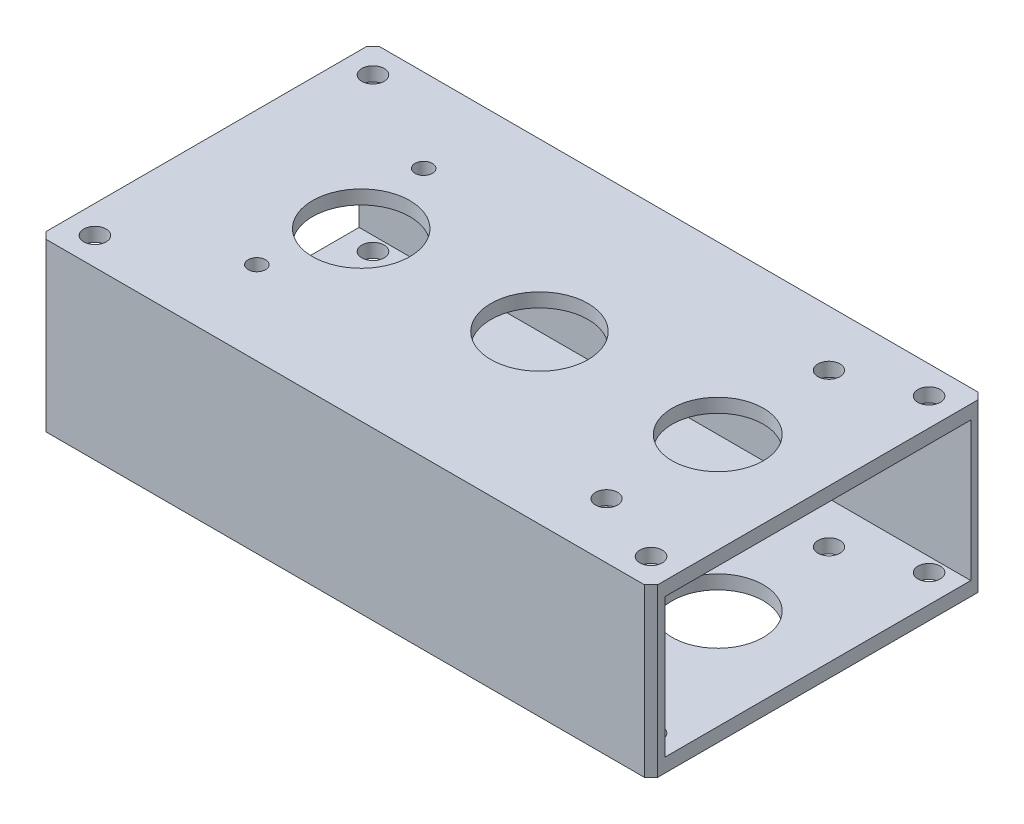
ISO-10303-21;
HEADER;
FILE_DESCRIPTION(('STEP AP214'),'2;1');
FILE_NAME('part.step','',(''),(''),'','','');
FILE_SCHEMA(('AUTOMOTIVE_DESIGN { 1 0 10303 214 1 1 1 1 }'));
ENDSEC;
DATA;
#1=APPLICATION_CONTEXT('core data for automotive mechanical design processes');
#2=APPLICATION_PROTOCOL_DEFINITION('international standard','automotive_design',2000,#1);
#3=PRODUCT_CONTEXT('',#1,'mechanical');
#4=PRODUCT('Part','Part','',(#3));
#5=PRODUCT_RELATED_PRODUCT_CATEGORY('part','',(#4));
#6=PRODUCT_DEFINITION_FORMATION('','',#4);
#7=PRODUCT_DEFINITION_CONTEXT('part definition',#1,'design');
#8=PRODUCT_DEFINITION('design','',#6,#7);
#9=PRODUCT_DEFINITION_SHAPE('','',#8);
#10=(LENGTH_UNIT() NAMED_UNIT(*) SI_UNIT(.MILLI.,.METRE.));
#11=(NAMED_UNIT(*) PLANE_ANGLE_UNIT() SI_UNIT($,.RADIAN.));
#12=(NAMED_UNIT(*) SI_UNIT($,.STERADIAN.) SOLID_ANGLE_UNIT());
#13=UNCERTAINTY_MEASURE_WITH_UNIT(LENGTH_MEASURE(1.E-05),#10,'distance_accuracy_value','');
#14=(GEOMETRIC_REPRESENTATION_CONTEXT(3) GLOBAL_UNCERTAINTY_ASSIGNED_CONTEXT((#13)) GLOBAL_UNIT_ASSIGNED_CONTEXT((#10,
#11,#12)) REPRESENTATION_CONTEXT('',''));
#15=CARTESIAN_POINT('',(0.,0.,0.));
#16=DIRECTION('',(0.,0.,1.));
#17=DIRECTION('',(1.,0.,0.));
#18=AXIS2_PLACEMENT_3D('',#15,#16,#17);
#19=CARTESIAN_POINT('',(30.6324,144.578053829409,-19.05));
#20=DIRECTION('',(0.,1.,0.));
#21=DIRECTION('',(0.,0.,1.));
#22=AXIS2_PLACEMENT_3D('',#19,#20,#21);
#23=CYLINDRICAL_SURFACE('',#22,1.98374);
#24=CARTESIAN_POINT('',(30.6324,-19.05,-19.05));
#25=DIRECTION('',(0.,1.,0.));
#26=DIRECTION('',(0.,0.,1.));
#27=AXIS2_PLACEMENT_3D('',#24,#25,#26);
#28=CIRCLE('',#27,1.98374);
#29=CARTESIAN_POINT('',(30.6324,-19.05,-17.06626));
#30=VERTEX_POINT('',#29);
#31=EDGE_CURVE('E146',#30,#30,#28,.T.);
#32=ORIENTED_EDGE('',*,*,#31,.F.);
#33=EDGE_LOOP('',(#32));
#34=FACE_BOUND('',#33,.T.);
#35=CARTESIAN_POINT('',(30.6324,-15.875,-19.05));
#36=DIRECTION('',(0.,1.,0.));
#37=DIRECTION('',(0.,0.,1.));
#38=AXIS2_PLACEMENT_3D('',#35,#36,#37);
#39=CIRCLE('',#38,1.98374);
#40=CARTESIAN_POINT('',(30.6324,-15.875,-17.06626));
#41=VERTEX_POINT('',#40);
#42=EDGE_CURVE('E20',#41,#41,#39,.T.);
#43=ORIENTED_EDGE('',*,*,#42,.T.);
#44=EDGE_LOOP('',(#43));
#45=FACE_BOUND('',#44,.T.);
#46=ADVANCED_FACE('F17',(#34,#45),#23,.F.);
#47=CARTESIAN_POINT('',(116.84,-144.578053829409,0.));
#48=DIRECTION('',(0.,-1.,0.));
#49=DIRECTION('',(0.,0.,-1.));
#50=AXIS2_PLACEMENT_3D('',#47,#48,#49);
#51=CYLINDRICAL_SURFACE('',#50,10.414);
#52=CARTESIAN_POINT('',(116.84,-19.05,0.));
#53=DIRECTION('',(0.,-1.,0.));
#54=DIRECTION('',(0.,0.,-1.));
#55=AXIS2_PLACEMENT_3D('',#52,#53,#54);
#56=CIRCLE('',#55,10.414);
#57=CARTESIAN_POINT('',(116.84,-19.05,-10.414));
#58=VERTEX_POINT('',#57);
#59=EDGE_CURVE('E241',#58,#58,#56,.F.);
#60=ORIENTED_EDGE('',*,*,#59,.F.);
#61=EDGE_LOOP('',(#60));
#62=FACE_BOUND('',#61,.T.);
#63=CARTESIAN_POINT('',(116.84,-15.875,0.));
#64=DIRECTION('',(0.,-1.,0.));
#65=DIRECTION('',(0.,0.,-1.));
#66=AXIS2_PLACEMENT_3D('',#63,#64,#65);
#67=CIRCLE('',#66,10.414);
#68=CARTESIAN_POINT('',(116.84,-15.875,-10.414));
#69=VERTEX_POINT('',#68);
#70=EDGE_CURVE('E269',#69,#69,#67,.F.);
#71=ORIENTED_EDGE('',*,*,#70,.T.);
#72=EDGE_LOOP('',(#71));
#73=FACE_BOUND('',#72,.T.);
#74=ADVANCED_FACE('F411',(#62,#73),#51,.F.);
#75=CARTESIAN_POINT('',(6.35000000000002,-144.578053829409,31.75));
#76=DIRECTION('',(0.,-1.,0.));
#77=DIRECTION('',(0.,0.,-1.));
#78=AXIS2_PLACEMENT_3D('',#75,#76,#77);
#79=CYLINDRICAL_SURFACE('',#78,2.5527);
#80=CARTESIAN_POINT('',(6.35000000000002,-19.05,31.75));
#81=DIRECTION('',(0.,-1.,0.));
#82=DIRECTION('',(0.,0.,-1.));
#83=AXIS2_PLACEMENT_3D('',#80,#81,#82);
#84=CIRCLE('',#83,2.5527);
#85=CARTESIAN_POINT('',(6.35000000000002,-19.05,29.1973));
#86=VERTEX_POINT('',#85);
#87=EDGE_CURVE('E238',#86,#86,#84,.F.);
#88=ORIENTED_EDGE('',*,*,#87,.F.);
#89=EDGE_LOOP('',(#88));
#90=FACE_BOUND('',#89,.T.);
#91=CARTESIAN_POINT('',(6.35000000000002,-15.875,31.75));
#92=DIRECTION('',(0.,-1.,0.));
#93=DIRECTION('',(0.,0.,-1.));
#94=AXIS2_PLACEMENT_3D('',#91,#92,#93);
#95=CIRCLE('',#94,2.5527);
#96=CARTESIAN_POINT('',(6.35000000000002,-15.875,29.1973));
#97=VERTEX_POINT('',#96);
#98=EDGE_CURVE('E267',#97,#97,#95,.F.);
#99=ORIENTED_EDGE('',*,*,#98,.T.);
#100=EDGE_LOOP('',(#99));
#101=FACE_BOUND('',#100,.T.);
#102=ADVANCED_FACE('F415',(#90,#101),#79,.F.);
#103=CARTESIAN_POINT('',(133.35,-144.578053829409,-31.75));
#104=DIRECTION('',(0.,-1.,0.));
#105=DIRECTION('',(0.,0.,-1.));
#106=AXIS2_PLACEMENT_3D('',#103,#104,#105);
#107=CYLINDRICAL_SURFACE('',#106,2.5527);
#108=CARTESIAN_POINT('',(133.35,-19.05,-31.75));
#109=DIRECTION('',(0.,-1.,0.));
#110=DIRECTION('',(0.,0.,-1.));
#111=AXIS2_PLACEMENT_3D('',#108,#109,#110);
#112=CIRCLE('',#111,2.5527);
#113=CARTESIAN_POINT('',(133.35,-19.05,-34.3027));
#114=VERTEX_POINT('',#113);
#115=EDGE_CURVE('E235',#114,#114,#112,.F.);
#116=ORIENTED_EDGE('',*,*,#115,.F.);
#117=EDGE_LOOP('',(#116));
#118=FACE_BOUND('',#117,.T.);
#119=CARTESIAN_POINT('',(133.35,-15.875,-31.75));
#120=DIRECTION('',(0.,-1.,0.));
#121=DIRECTION('',(0.,0.,-1.));
#122=AXIS2_PLACEMENT_3D('',#119,#120,#121);
#123=CIRCLE('',#122,2.5527);
#124=CARTESIAN_POINT('',(133.35,-15.875,-34.3027));
#125=VERTEX_POINT('',#124);
#126=EDGE_CURVE('E264',#125,#125,#123,.F.);
#127=ORIENTED_EDGE('',*,*,#126,.T.);
#128=EDGE_LOOP('',(#127));
#129=FACE_BOUND('',#128,.T.);
#130=ADVANCED_FACE('F420',(#118,#129),#107,.F.);
#131=CARTESIAN_POINT('',(76.1238,-144.578053829409,0.));
#132=DIRECTION('',(0.,-1.,0.));
#133=DIRECTION('',(0.,0.,-1.));
#134=AXIS2_PLACEMENT_3D('',#131,#132,#133);
#135=CYLINDRICAL_SURFACE('',#134,11.10615);
#136=CARTESIAN_POINT('',(76.1238,-19.05,0.));
#137=DIRECTION('',(0.,-1.,0.));
#138=DIRECTION('',(0.,0.,-1.));
#139=AXIS2_PLACEMENT_3D('',#136,#137,#138);
#140=CIRCLE('',#139,11.10615);
#141=CARTESIAN_POINT('',(76.1238,-19.05,-11.10615));
#142=VERTEX_POINT('',#141);
#143=EDGE_CURVE('E232',#142,#142,#140,.F.);
#144=ORIENTED_EDGE('',*,*,#143,.F.);
#145=EDGE_LOOP('',(#144));
#146=FACE_BOUND('',#145,.T.);
#147=CARTESIAN_POINT('',(76.1238,-15.875,0.));
#148=DIRECTION('',(0.,-1.,0.));
#149=DIRECTION('',(0.,0.,-1.));
#150=AXIS2_PLACEMENT_3D('',#147,#148,#149);
#151=CIRCLE('',#150,11.10615);
#152=CARTESIAN_POINT('',(76.1238,-15.875,-11.10615));
#153=VERTEX_POINT('',#152);
#154=EDGE_CURVE('E261',#153,#153,#151,.F.);
#155=ORIENTED_EDGE('',*,*,#154,.T.);
#156=EDGE_LOOP('',(#155));
#157=FACE_BOUND('',#156,.T.);
#158=ADVANCED_FACE('F426',(#146,#157),#135,.F.);
#159=CARTESIAN_POINT('',(116.84,-144.578053829409,-25.4));
#160=DIRECTION('',(0.,-1.,0.));
#161=DIRECTION('',(0.,0.,-1.));
#162=AXIS2_PLACEMENT_3D('',#159,#160,#161);
#163=CYLINDRICAL_SURFACE('',#162,2.5273);
#164=CARTESIAN_POINT('',(116.84,-19.05,-25.4));
#165=DIRECTION('',(0.,-1.,0.));
#166=DIRECTION('',(0.,0.,-1.));
#167=AXIS2_PLACEMENT_3D('',#164,#165,#166);
#168=CIRCLE('',#167,2.5273);
#169=CARTESIAN_POINT('',(116.84,-19.05,-27.9273));
#170=VERTEX_POINT('',#169);
#171=EDGE_CURVE('E229',#170,#170,#168,.F.);
#172=ORIENTED_EDGE('',*,*,#171,.F.);
#173=EDGE_LOOP('',(#172));
#174=FACE_BOUND('',#173,.T.);
#175=CARTESIAN_POINT('',(116.84,-15.875,-25.4));
#176=DIRECTION('',(0.,-1.,0.));
#177=DIRECTION('',(0.,0.,-1.));
#178=AXIS2_PLACEMENT_3D('',#175,#176,#177);
#179=CIRCLE('',#178,2.5273);
#180=CARTESIAN_POINT('',(116.84,-15.875,-27.9273));
#181=VERTEX_POINT('',#180);
#182=EDGE_CURVE('E150',#181,#181,#179,.F.);
#183=ORIENTED_EDGE('',*,*,#182,.T.);
#184=EDGE_LOOP('',(#183));
#185=FACE_BOUND('',#184,.T.);
#186=ADVANCED_FACE('F430',(#174,#185),#163,.F.);
#187=CARTESIAN_POINT('',(116.84,-144.578053829409,25.4));
#188=DIRECTION('',(0.,-1.,0.));
#189=DIRECTION('',(0.,0.,-1.));
#190=AXIS2_PLACEMENT_3D('',#187,#188,#189);
#191=CYLINDRICAL_SURFACE('',#190,2.5273);
#192=CARTESIAN_POINT('',(116.84,-19.05,25.4));
#193=DIRECTION('',(0.,-1.,0.));
#194=DIRECTION('',(0.,0.,-1.));
#195=AXIS2_PLACEMENT_3D('',#192,#193,#194);
#196=CIRCLE('',#195,2.5273);
#197=CARTESIAN_POINT('',(116.84,-19.05,22.8727));
#198=VERTEX_POINT('',#197);
#199=EDGE_CURVE('E226',#198,#198,#196,.F.);
#200=ORIENTED_EDGE('',*,*,#199,.F.);
#201=EDGE_LOOP('',(#200));
#202=FACE_BOUND('',#201,.T.);
#203=CARTESIAN_POINT('',(116.84,-15.875,25.4));
#204=DIRECTION('',(0.,-1.,0.));
#205=DIRECTION('',(0.,0.,-1.));
#206=AXIS2_PLACEMENT_3D('',#203,#204,#205);
#207=CIRCLE('',#206,2.5273);
#208=CARTESIAN_POINT('',(116.84,-15.875,22.8727));
#209=VERTEX_POINT('',#208);
#210=EDGE_CURVE('E149',#209,#209,#207,.F.);
#211=ORIENTED_EDGE('',*,*,#210,.T.);
#212=EDGE_LOOP('',(#211));
#213=FACE_BOUND('',#212,.T.);
#214=ADVANCED_FACE('F434',(#202,#213),#191,.F.);
#215=CARTESIAN_POINT('',(133.35,-144.578053829409,31.75));
#216=DIRECTION('',(0.,-1.,0.));
#217=DIRECTION('',(0.,0.,-1.));
#218=AXIS2_PLACEMENT_3D('',#215,#216,#217);
#219=CYLINDRICAL_SURFACE('',#218,2.5527);
#220=CARTESIAN_POINT('',(133.35,-19.05,31.75));
#221=DIRECTION('',(0.,-1.,0.));
#222=DIRECTION('',(0.,0.,-1.));
#223=AXIS2_PLACEMENT_3D('',#220,#221,#222);
#224=CIRCLE('',#223,2.5527);
#225=CARTESIAN_POINT('',(133.35,-19.05,29.1973));
#226=VERTEX_POINT('',#225);
#227=EDGE_CURVE('E223',#226,#226,#224,.F.);
#228=ORIENTED_EDGE('',*,*,#227,.F.);
#229=EDGE_LOOP('',(#228));
#230=FACE_BOUND('',#229,.T.);
#231=CARTESIAN_POINT('',(133.35,-15.875,31.75));
#232=DIRECTION('',(0.,-1.,0.));
#233=DIRECTION('',(0.,0.,-1.));
#234=AXIS2_PLACEMENT_3D('',#231,#232,#233);
#235=CIRCLE('',#234,2.5527);
#236=CARTESIAN_POINT('',(133.35,-15.875,29.1973));
#237=VERTEX_POINT('',#236);
#238=EDGE_CURVE('E254',#237,#237,#235,.F.);
#239=ORIENTED_EDGE('',*,*,#238,.T.);
#240=EDGE_LOOP('',(#239));
#241=FACE_BOUND('',#240,.T.);
#242=ADVANCED_FACE('F438',(#230,#241),#219,.F.);
#243=CARTESIAN_POINT('',(6.34999999999999,-144.578053829409,-31.75));
#244=DIRECTION('',(0.,-1.,0.));
#245=DIRECTION('',(0.,0.,-1.));
#246=AXIS2_PLACEMENT_3D('',#243,#244,#245);
#247=CYLINDRICAL_SURFACE('',#246,2.5527);
#248=CARTESIAN_POINT('',(6.34999999999999,-19.05,-31.75));
#249=DIRECTION('',(0.,-1.,0.));
#250=DIRECTION('',(0.,0.,-1.));
#251=AXIS2_PLACEMENT_3D('',#248,#249,#250);
#252=CIRCLE('',#251,2.5527);
#253=CARTESIAN_POINT('',(6.34999999999999,-19.05,-34.3027));
#254=VERTEX_POINT('',#253);
#255=EDGE_CURVE('E220',#254,#254,#252,.F.);
#256=ORIENTED_EDGE('',*,*,#255,.F.);
#257=EDGE_LOOP('',(#256));
#258=FACE_BOUND('',#257,.T.);
#259=CARTESIAN_POINT('',(6.34999999999999,-15.875,-31.75));
#260=DIRECTION('',(0.,-1.,0.));
#261=DIRECTION('',(0.,0.,-1.));
#262=AXIS2_PLACEMENT_3D('',#259,#260,#261);
#263=CIRCLE('',#262,2.5527);
#264=CARTESIAN_POINT('',(6.34999999999999,-15.875,-34.3027));
#265=VERTEX_POINT('',#264);
#266=EDGE_CURVE('E251',#265,#265,#263,.F.);
#267=ORIENTED_EDGE('',*,*,#266,.T.);
#268=EDGE_LOOP('',(#267));
#269=FACE_BOUND('',#268,.T.);
#270=ADVANCED_FACE('F442',(#258,#269),#247,.F.);
#271=CARTESIAN_POINT('',(35.4076,144.578053829409,0.));
#272=DIRECTION('',(0.,1.,0.));
#273=DIRECTION('',(0.,0.,1.));
#274=AXIS2_PLACEMENT_3D('',#271,#272,#273);
#275=CYLINDRICAL_SURFACE('',#274,14.28115);
#276=CARTESIAN_POINT('',(35.4076,-19.05,0.));
#277=DIRECTION('',(0.,1.,0.));
#278=DIRECTION('',(0.,0.,1.));
#279=AXIS2_PLACEMENT_3D('',#276,#277,#278);
#280=CIRCLE('',#279,14.28115);
#281=CARTESIAN_POINT('',(35.4076,-19.05,14.28115));
#282=VERTEX_POINT('',#281);
#283=EDGE_CURVE('E217',#282,#282,#280,.T.);
#284=ORIENTED_EDGE('',*,*,#283,.F.);
#285=EDGE_LOOP('',(#284));
#286=FACE_BOUND('',#285,.T.);
#287=CARTESIAN_POINT('',(35.4076,-15.875,0.));
#288=DIRECTION('',(0.,1.,0.));
#289=DIRECTION('',(0.,0.,1.));
#290=AXIS2_PLACEMENT_3D('',#287,#288,#289);
#291=CIRCLE('',#290,14.28115);
#292=CARTESIAN_POINT('',(35.4076,-15.875,14.28115));
#293=VERTEX_POINT('',#292);
#294=EDGE_CURVE('E248',#293,#293,#291,.T.);
#295=ORIENTED_EDGE('',*,*,#294,.T.);
#296=EDGE_LOOP('',(#295));
#297=FACE_BOUND('',#296,.T.);
#298=ADVANCED_FACE('F446',(#286,#297),#275,.F.);
#299=CARTESIAN_POINT('',(30.6324,144.578053829409,19.05));
#300=DIRECTION('',(0.,1.,0.));
#301=DIRECTION('',(0.,0.,1.));
#302=AXIS2_PLACEMENT_3D('',#299,#300,#301);
#303=CYLINDRICAL_SURFACE('',#302,1.98374);
#304=CARTESIAN_POINT('',(30.6324,-19.05,19.05));
#305=DIRECTION('',(0.,1.,0.));
#306=DIRECTION('',(0.,0.,1.));
#307=AXIS2_PLACEMENT_3D('',#304,#305,#306);
#308=CIRCLE('',#307,1.98374);
#309=CARTESIAN_POINT('',(30.6324,-19.05,21.03374));
#310=VERTEX_POINT('',#309);
#311=EDGE_CURVE('E143',#310,#310,#308,.T.);
#312=ORIENTED_EDGE('',*,*,#311,.F.);
#313=EDGE_LOOP('',(#312));
#314=FACE_BOUND('',#313,.T.);
#315=CARTESIAN_POINT('',(30.6324,-15.875,19.05));
#316=DIRECTION('',(0.,1.,0.));
#317=DIRECTION('',(0.,0.,1.));
#318=AXIS2_PLACEMENT_3D('',#315,#316,#317);
#319=CIRCLE('',#318,1.98374);
#320=CARTESIAN_POINT('',(30.6324,-15.875,21.03374));
#321=VERTEX_POINT('',#320);
#322=EDGE_CURVE('E147',#321,#321,#319,.T.);
#323=ORIENTED_EDGE('',*,*,#322,.T.);
#324=EDGE_LOOP('',(#323));
#325=FACE_BOUND('',#324,.T.);
#326=ADVANCED_FACE('F289',(#314,#325),#303,.F.);
#327=CARTESIAN_POINT('',(139.7,-15.875,34.925));
#328=DIRECTION('',(0.,0.,1.));
#329=DIRECTION('',(0.,-1.,0.));
#330=AXIS2_PLACEMENT_3D('',#327,#328,#329);
#331=PLANE('',#330);
#332=DIRECTION('',(1.,0.,0.));
#333=VECTOR('',#332,1.);
#334=CARTESIAN_POINT('',(139.7,15.875,34.925));
#335=LINE('',#334,#333);
#336=CARTESIAN_POINT('',(0.,15.875,34.925));
#337=VERTEX_POINT('',#336);
#338=CARTESIAN_POINT('',(139.7,15.875,34.925));
#339=VERTEX_POINT('',#338);
#340=EDGE_CURVE('E116',#337,#339,#335,.T.);
#341=ORIENTED_EDGE('',*,*,#340,.T.);
#342=DIRECTION('',(0.,-1.,0.));
#343=VECTOR('',#342,1.);
#344=CARTESIAN_POINT('',(139.7,-19.05,34.925));
#345=LINE('',#344,#343);
#346=CARTESIAN_POINT('',(139.7,-15.875,34.925));
#347=VERTEX_POINT('',#346);
#348=EDGE_CURVE('E694',#339,#347,#345,.T.);
#349=ORIENTED_EDGE('',*,*,#348,.T.);
#350=DIRECTION('',(1.,0.,0.));
#351=VECTOR('',#350,1.);
#352=CARTESIAN_POINT('',(139.7,-15.875,34.925));
#353=LINE('',#352,#351);
#354=CARTESIAN_POINT('',(0.,-15.875,34.925));
#355=VERTEX_POINT('',#354);
#356=EDGE_CURVE('E148',#347,#355,#353,.F.);
#357=ORIENTED_EDGE('',*,*,#356,.T.);
#358=DIRECTION('',(0.,-1.,0.));
#359=VECTOR('',#358,1.);
#360=CARTESIAN_POINT('',(0.,-19.05,34.925));
#361=LINE('',#360,#359);
#362=EDGE_CURVE('E125',#337,#355,#361,.T.);
#363=ORIENTED_EDGE('',*,*,#362,.F.);
#364=EDGE_LOOP('',(#341,#349,#357,#363));
#365=FACE_BOUND('',#364,.T.);
#366=ADVANCED_FACE('F279',(#365),#331,.F.);
#367=CARTESIAN_POINT('',(139.7,-15.875,-34.925));
#368=DIRECTION('',(0.,-1.,0.));
#369=DIRECTION('',(0.,0.,-1.));
#370=AXIS2_PLACEMENT_3D('',#367,#368,#369);
#371=PLANE('',#370);
#372=ORIENTED_EDGE('',*,*,#322,.F.);
#373=EDGE_LOOP('',(#372));
#374=FACE_BOUND('',#373,.T.);
#375=ORIENTED_EDGE('',*,*,#294,.F.);
#376=EDGE_LOOP('',(#375));
#377=FACE_BOUND('',#376,.T.);
#378=ORIENTED_EDGE('',*,*,#266,.F.);
#379=EDGE_LOOP('',(#378));
#380=FACE_BOUND('',#379,.T.);
#381=ORIENTED_EDGE('',*,*,#238,.F.);
#382=EDGE_LOOP('',(#381));
#383=FACE_BOUND('',#382,.T.);
#384=ORIENTED_EDGE('',*,*,#210,.F.);
#385=EDGE_LOOP('',(#384));
#386=FACE_BOUND('',#385,.T.);
#387=ORIENTED_EDGE('',*,*,#356,.F.);
#388=DIRECTION('',(0.,0.,1.));
#389=VECTOR('',#388,1.);
#390=CARTESIAN_POINT('',(139.7,-15.875,38.1));
#391=LINE('',#390,#389);
#392=CARTESIAN_POINT('',(139.7,-15.875,-34.925));
#393=VERTEX_POINT('',#392);
#394=EDGE_CURVE('E691',#347,#393,#391,.F.);
#395=ORIENTED_EDGE('',*,*,#394,.T.);
#396=DIRECTION('',(1.,0.,0.));
#397=VECTOR('',#396,1.);
#398=CARTESIAN_POINT('',(139.7,-15.875,-34.925));
#399=LINE('',#398,#397);
#400=CARTESIAN_POINT('',(0.,-15.875,-34.925));
#401=VERTEX_POINT('',#400);
#402=EDGE_CURVE('E144',#393,#401,#399,.F.);
#403=ORIENTED_EDGE('',*,*,#402,.T.);
#404=DIRECTION('',(0.,0.,1.));
#405=VECTOR('',#404,1.);
#406=CARTESIAN_POINT('',(0.,-15.875,38.1));
#407=LINE('',#406,#405);
#408=EDGE_CURVE('E129',#355,#401,#407,.F.);
#409=ORIENTED_EDGE('',*,*,#408,.F.);
#410=EDGE_LOOP('',(#387,#395,#403,#409));
#411=FACE_BOUND('',#410,.T.);
#412=ORIENTED_EDGE('',*,*,#182,.F.);
#413=EDGE_LOOP('',(#412));
#414=FACE_BOUND('',#413,.T.);
#415=ORIENTED_EDGE('',*,*,#154,.F.);
#416=EDGE_LOOP('',(#415));
#417=FACE_BOUND('',#416,.T.);
#418=ORIENTED_EDGE('',*,*,#126,.F.);
#419=EDGE_LOOP('',(#418));
#420=FACE_BOUND('',#419,.T.);
#421=ORIENTED_EDGE('',*,*,#98,.F.);
#422=EDGE_LOOP('',(#421));
#423=FACE_BOUND('',#422,.T.);
#424=ORIENTED_EDGE('',*,*,#70,.F.);
#425=EDGE_LOOP('',(#424));
#426=FACE_BOUND('',#425,.T.);
#427=ORIENTED_EDGE('',*,*,#42,.F.);
#428=EDGE_LOOP('',(#427));
#429=FACE_BOUND('',#428,.T.);
#430=ADVANCED_FACE('F277',(#374,#377,#380,#383,#386,#411,#414,#417,#420,#423,#426,#429),#371,.F.);
#431=CARTESIAN_POINT('',(139.7,15.875,-34.925));
#432=DIRECTION('',(0.,0.,-1.));
#433=DIRECTION('',(0.,1.,0.));
#434=AXIS2_PLACEMENT_3D('',#431,#432,#433);
#435=PLANE('',#434);
#436=ORIENTED_EDGE('',*,*,#402,.F.);
#437=DIRECTION('',(0.,-1.,0.));
#438=VECTOR('',#437,1.);
#439=CARTESIAN_POINT('',(139.7,-19.05,-34.925));
#440=LINE('',#439,#438);
#441=CARTESIAN_POINT('',(139.7,15.875,-34.925));
#442=VERTEX_POINT('',#441);
#443=EDGE_CURVE('E111',#393,#442,#440,.F.);
#444=ORIENTED_EDGE('',*,*,#443,.T.);
#445=DIRECTION('',(1.,0.,0.));
#446=VECTOR('',#445,1.);
#447=CARTESIAN_POINT('',(139.7,15.875,-34.925));
#448=LINE('',#447,#446);
#449=CARTESIAN_POINT('',(0.,15.875,-34.925));
#450=VERTEX_POINT('',#449);
#451=EDGE_CURVE('E103',#442,#450,#448,.F.);
#452=ORIENTED_EDGE('',*,*,#451,.T.);
#453=DIRECTION('',(0.,-1.,0.));
#454=VECTOR('',#453,1.);
#455=CARTESIAN_POINT('',(0.,-19.05,-34.925));
#456=LINE('',#455,#454);
#457=EDGE_CURVE('E108',#401,#450,#456,.F.);
#458=ORIENTED_EDGE('',*,*,#457,.F.);
#459=EDGE_LOOP('',(#436,#444,#452,#458));
#460=FACE_BOUND('',#459,.T.);
#461=ADVANCED_FACE('F106',(#460),#435,.F.);
#462=CARTESIAN_POINT('',(139.7,-19.05,-38.1));
#463=DIRECTION('',(0.,-1.,0.));
#464=DIRECTION('',(0.,0.,-1.));
#465=AXIS2_PLACEMENT_3D('',#462,#463,#464);
#466=PLANE('',#465);
#467=ORIENTED_EDGE('',*,*,#311,.T.);
#468=EDGE_LOOP('',(#467));
#469=FACE_BOUND('',#468,.T.);
#470=ORIENTED_EDGE('',*,*,#283,.T.);
#471=EDGE_LOOP('',(#470));
#472=FACE_BOUND('',#471,.T.);
#473=ORIENTED_EDGE('',*,*,#255,.T.);
#474=EDGE_LOOP('',(#473));
#475=FACE_BOUND('',#474,.T.);
#476=ORIENTED_EDGE('',*,*,#227,.T.);
#477=EDGE_LOOP('',(#476));
#478=FACE_BOUND('',#477,.T.);
#479=ORIENTED_EDGE('',*,*,#199,.T.);
#480=EDGE_LOOP('',(#479));
#481=FACE_BOUND('',#480,.T.);
#482=DIRECTION('',(1.,0.,0.));
#483=VECTOR('',#482,1.);
#484=CARTESIAN_POINT('',(139.7,-19.05,38.1));
#485=LINE('',#484,#483);
#486=CARTESIAN_POINT('',(1.52400000000002,-19.05,38.1));
#487=VERTEX_POINT('',#486);
#488=CARTESIAN_POINT('',(138.176,-19.05,38.1));
#489=VERTEX_POINT('',#488);
#490=EDGE_CURVE('E396',#487,#489,#485,.T.);
#491=ORIENTED_EDGE('',*,*,#490,.F.);
#492=DIRECTION('',(-0.707106781186548,0.,-0.707106781186547));
#493=VECTOR('',#492,1.);
#494=CARTESIAN_POINT('',(0.,-19.05,36.576));
#495=LINE('',#494,#493);
#496=CARTESIAN_POINT('',(0.,-19.05,36.576));
#497=VERTEX_POINT('',#496);
#498=EDGE_CURVE('E712',#487,#497,#495,.T.);
#499=ORIENTED_EDGE('',*,*,#498,.T.);
#500=DIRECTION('',(0.,0.,1.));
#501=VECTOR('',#500,1.);
#502=CARTESIAN_POINT('',(0.,-19.05,38.1));
#503=LINE('',#502,#501);
#504=CARTESIAN_POINT('',(0.,-19.05,-36.576));
#505=VERTEX_POINT('',#504);
#506=EDGE_CURVE('E716',#505,#497,#503,.T.);
#507=ORIENTED_EDGE('',*,*,#506,.F.);
#508=DIRECTION('',(0.707106781186547,0.,-0.707106781186548));
#509=VECTOR('',#508,1.);
#510=CARTESIAN_POINT('',(0.,-19.05,-36.576));
#511=LINE('',#510,#509);
#512=CARTESIAN_POINT('',(1.524,-19.05,-38.1));
#513=VERTEX_POINT('',#512);
#514=EDGE_CURVE('E132',#505,#513,#511,.T.);
#515=ORIENTED_EDGE('',*,*,#514,.T.);
#516=DIRECTION('',(1.,0.,0.));
#517=VECTOR('',#516,1.);
#518=CARTESIAN_POINT('',(139.7,-19.05,-38.1));
#519=LINE('',#518,#517);
#520=CARTESIAN_POINT('',(138.176,-19.05,-38.1));
#521=VERTEX_POINT('',#520);
#522=EDGE_CURVE('E138',#521,#513,#519,.F.);
#523=ORIENTED_EDGE('',*,*,#522,.F.);
#524=DIRECTION('',(-0.707106781186548,0.,-0.707106781186547));
#525=VECTOR('',#524,1.);
#526=CARTESIAN_POINT('',(138.176,-19.05,-38.1));
#527=LINE('',#526,#525);
#528=CARTESIAN_POINT('',(139.7,-19.05,-36.576));
#529=VERTEX_POINT('',#528);
#530=EDGE_CURVE('E748',#529,#521,#527,.T.);
#531=ORIENTED_EDGE('',*,*,#530,.F.);
#532=DIRECTION('',(0.,0.,1.));
#533=VECTOR('',#532,1.);
#534=CARTESIAN_POINT('',(139.7,-19.05,38.1));
#535=LINE('',#534,#533);
#536=CARTESIAN_POINT('',(139.7,-19.05,36.576));
#537=VERTEX_POINT('',#536);
#538=EDGE_CURVE('E752',#529,#537,#535,.T.);
#539=ORIENTED_EDGE('',*,*,#538,.T.);
#540=DIRECTION('',(0.707106781186548,0.,-0.707106781186548));
#541=VECTOR('',#540,1.);
#542=CARTESIAN_POINT('',(138.176,-19.05,38.1));
#543=LINE('',#542,#541);
#544=EDGE_CURVE('E706',#489,#537,#543,.T.);
#545=ORIENTED_EDGE('',*,*,#544,.F.);
#546=EDGE_LOOP('',(#491,#499,#507,#515,#523,#531,#539,#545));
#547=FACE_BOUND('',#546,.T.);
#548=ORIENTED_EDGE('',*,*,#171,.T.);
#549=EDGE_LOOP('',(#548));
#550=FACE_BOUND('',#549,.T.);
#551=ORIENTED_EDGE('',*,*,#143,.T.);
#552=EDGE_LOOP('',(#551));
#553=FACE_BOUND('',#552,.T.);
#554=ORIENTED_EDGE('',*,*,#115,.T.);
#555=EDGE_LOOP('',(#554));
#556=FACE_BOUND('',#555,.T.);
#557=ORIENTED_EDGE('',*,*,#87,.T.);
#558=EDGE_LOOP('',(#557));
#559=FACE_BOUND('',#558,.T.);
#560=ORIENTED_EDGE('',*,*,#59,.T.);
#561=EDGE_LOOP('',(#560));
#562=FACE_BOUND('',#561,.T.);
#563=ORIENTED_EDGE('',*,*,#31,.T.);
#564=EDGE_LOOP('',(#563));
#565=FACE_BOUND('',#564,.T.);
#566=ADVANCED_FACE('F287',(#469,#472,#475,#478,#481,#547,#550,#553,#556,#559,#562,#565),#466,.T.);
#567=CARTESIAN_POINT('',(139.7,15.875,34.925));
#568=DIRECTION('',(0.,1.,0.));
#569=DIRECTION('',(0.,0.,1.));
#570=AXIS2_PLACEMENT_3D('',#567,#568,#569);
#571=PLANE('',#570);
#572=CARTESIAN_POINT('',(6.34999999999999,15.875,-31.75));
#573=DIRECTION('',(0.,-1.,0.));
#574=DIRECTION('',(0.,0.,-1.));
#575=AXIS2_PLACEMENT_3D('',#572,#573,#574);
#576=CIRCLE('',#575,2.5527);
#577=CARTESIAN_POINT('',(6.34999999999999,15.875,-34.3027));
#578=VERTEX_POINT('',#577);
#579=EDGE_CURVE('E183',#578,#578,#576,.F.);
#580=ORIENTED_EDGE('',*,*,#579,.T.);
#581=EDGE_LOOP('',(#580));
#582=FACE_BOUND('',#581,.T.);
#583=CARTESIAN_POINT('',(133.35,15.875,31.75));
#584=DIRECTION('',(0.,-1.,0.));
#585=DIRECTION('',(0.,0.,-1.));
#586=AXIS2_PLACEMENT_3D('',#583,#584,#585);
#587=CIRCLE('',#586,2.5527);
#588=CARTESIAN_POINT('',(133.35,15.875,29.1973));
#589=VERTEX_POINT('',#588);
#590=EDGE_CURVE('E186',#589,#589,#587,.F.);
#591=ORIENTED_EDGE('',*,*,#590,.T.);
#592=EDGE_LOOP('',(#591));
#593=FACE_BOUND('',#592,.T.);
#594=CARTESIAN_POINT('',(116.84,15.875,25.4));
#595=DIRECTION('',(0.,-1.,0.));
#596=DIRECTION('',(0.,0.,-1.));
#597=AXIS2_PLACEMENT_3D('',#594,#595,#596);
#598=CIRCLE('',#597,2.5273);
#599=CARTESIAN_POINT('',(116.84,15.875,22.8727));
#600=VERTEX_POINT('',#599);
#601=EDGE_CURVE('E189',#600,#600,#598,.F.);
#602=ORIENTED_EDGE('',*,*,#601,.T.);
#603=EDGE_LOOP('',(#602));
#604=FACE_BOUND('',#603,.T.);
#605=ORIENTED_EDGE('',*,*,#451,.F.);
#606=DIRECTION('',(0.,0.,1.));
#607=VECTOR('',#606,1.);
#608=CARTESIAN_POINT('',(139.7,15.875,38.1));
#609=LINE('',#608,#607);
#610=EDGE_CURVE('E698',#442,#339,#609,.T.);
#611=ORIENTED_EDGE('',*,*,#610,.T.);
#612=ORIENTED_EDGE('',*,*,#340,.F.);
#613=DIRECTION('',(0.,0.,1.));
#614=VECTOR('',#613,1.);
#615=CARTESIAN_POINT('',(0.,15.875,38.1));
#616=LINE('',#615,#614);
#617=EDGE_CURVE('E119',#450,#337,#616,.T.);
#618=ORIENTED_EDGE('',*,*,#617,.F.);
#619=EDGE_LOOP('',(#605,#611,#612,#618));
#620=FACE_BOUND('',#619,.T.);
#621=CARTESIAN_POINT('',(116.84,15.875,-25.4));
#622=DIRECTION('',(0.,-1.,0.));
#623=DIRECTION('',(0.,0.,-1.));
#624=AXIS2_PLACEMENT_3D('',#621,#622,#623);
#625=CIRCLE('',#624,2.5273);
#626=CARTESIAN_POINT('',(116.84,15.875,-27.9273));
#627=VERTEX_POINT('',#626);
#628=EDGE_CURVE('E140',#627,#627,#625,.F.);
#629=ORIENTED_EDGE('',*,*,#628,.T.);
#630=EDGE_LOOP('',(#629));
#631=FACE_BOUND('',#630,.T.);
#632=CARTESIAN_POINT('',(76.1238,15.875,0.));
#633=DIRECTION('',(0.,-1.,0.));
#634=DIRECTION('',(0.,0.,-1.));
#635=AXIS2_PLACEMENT_3D('',#632,#633,#634);
#636=CIRCLE('',#635,11.10615);
#637=CARTESIAN_POINT('',(76.1238,15.875,-11.10615));
#638=VERTEX_POINT('',#637);
#639=EDGE_CURVE('E195',#638,#638,#636,.F.);
#640=ORIENTED_EDGE('',*,*,#639,.T.);
#641=EDGE_LOOP('',(#640));
#642=FACE_BOUND('',#641,.T.);
#643=CARTESIAN_POINT('',(133.35,15.875,-31.75));
#644=DIRECTION('',(0.,-1.,0.));
#645=DIRECTION('',(0.,0.,-1.));
#646=AXIS2_PLACEMENT_3D('',#643,#644,#645);
#647=CIRCLE('',#646,2.5527);
#648=CARTESIAN_POINT('',(133.35,15.875,-34.3027));
#649=VERTEX_POINT('',#648);
#650=EDGE_CURVE('E198',#649,#649,#647,.F.);
#651=ORIENTED_EDGE('',*,*,#650,.T.);
#652=EDGE_LOOP('',(#651));
#653=FACE_BOUND('',#652,.T.);
#654=CARTESIAN_POINT('',(6.35000000000002,15.875,31.75));
#655=DIRECTION('',(0.,-1.,0.));
#656=DIRECTION('',(0.,0.,-1.));
#657=AXIS2_PLACEMENT_3D('',#654,#655,#656);
#658=CIRCLE('',#657,2.5527);
#659=CARTESIAN_POINT('',(6.35000000000002,15.875,29.1973));
#660=VERTEX_POINT('',#659);
#661=EDGE_CURVE('E201',#660,#660,#658,.F.);
#662=ORIENTED_EDGE('',*,*,#661,.T.);
#663=EDGE_LOOP('',(#662));
#664=FACE_BOUND('',#663,.T.);
#665=CARTESIAN_POINT('',(116.84,15.875,0.));
#666=DIRECTION('',(0.,-1.,0.));
#667=DIRECTION('',(0.,0.,-1.));
#668=AXIS2_PLACEMENT_3D('',#665,#666,#667);
#669=CIRCLE('',#668,10.414);
#670=CARTESIAN_POINT('',(116.84,15.875,-10.414));
#671=VERTEX_POINT('',#670);
#672=EDGE_CURVE('E204',#671,#671,#669,.F.);
#673=ORIENTED_EDGE('',*,*,#672,.T.);
#674=EDGE_LOOP('',(#673));
#675=FACE_BOUND('',#674,.T.);
#676=CARTESIAN_POINT('',(35.4076,15.875,0.));
#677=DIRECTION('',(0.,-1.,0.));
#678=DIRECTION('',(0.,0.,-1.));
#679=AXIS2_PLACEMENT_3D('',#676,#677,#678);
#680=CIRCLE('',#679,11.10615);
#681=CARTESIAN_POINT('',(35.4076,15.875,-11.10615));
#682=VERTEX_POINT('',#681);
#683=EDGE_CURVE('E207',#682,#682,#680,.F.);
#684=ORIENTED_EDGE('',*,*,#683,.T.);
#685=EDGE_LOOP('',(#684));
#686=FACE_BOUND('',#685,.T.);
#687=CARTESIAN_POINT('',(30.6324,15.875,19.05));
#688=DIRECTION('',(0.,-1.,0.));
#689=DIRECTION('',(0.,0.,-1.));
#690=AXIS2_PLACEMENT_3D('',#687,#688,#689);
#691=CIRCLE('',#690,1.98374);
#692=CARTESIAN_POINT('',(30.6324,15.875,17.06626));
#693=VERTEX_POINT('',#692);
#694=EDGE_CURVE('E210',#693,#693,#691,.F.);
#695=ORIENTED_EDGE('',*,*,#694,.T.);
#696=EDGE_LOOP('',(#695));
#697=FACE_BOUND('',#696,.T.);
#698=CARTESIAN_POINT('',(30.6324,15.875,-19.05));
#699=DIRECTION('',(0.,-1.,0.));
#700=DIRECTION('',(0.,0.,-1.));
#701=AXIS2_PLACEMENT_3D('',#698,#699,#700);
#702=CIRCLE('',#701,1.98374);
#703=CARTESIAN_POINT('',(30.6324,15.875,-21.03374));
#704=VERTEX_POINT('',#703);
#705=EDGE_CURVE('E115',#704,#704,#702,.F.);
#706=ORIENTED_EDGE('',*,*,#705,.T.);
#707=EDGE_LOOP('',(#706));
#708=FACE_BOUND('',#707,.T.);
#709=ADVANCED_FACE('F120',(#582,#593,#604,#620,#631,#642,#653,#664,#675,#686,#697,#708),#571,.F.);
#710=CARTESIAN_POINT('',(30.6324,-144.578053829409,-19.05));
#711=DIRECTION('',(0.,-1.,0.));
#712=DIRECTION('',(0.,0.,-1.));
#713=AXIS2_PLACEMENT_3D('',#710,#711,#712);
#714=CYLINDRICAL_SURFACE('',#713,1.98374);
#715=CARTESIAN_POINT('',(30.6324,19.05,-19.05));
#716=DIRECTION('',(0.,-1.,0.));
#717=DIRECTION('',(0.,0.,-1.));
#718=AXIS2_PLACEMENT_3D('',#715,#716,#717);
#719=CIRCLE('',#718,1.98374);
#720=CARTESIAN_POINT('',(30.6324,19.05,-21.03374));
#721=VERTEX_POINT('',#720);
#722=EDGE_CURVE('E180',#721,#721,#719,.T.);
#723=ORIENTED_EDGE('',*,*,#722,.F.);
#724=EDGE_LOOP('',(#723));
#725=FACE_BOUND('',#724,.T.);
#726=ORIENTED_EDGE('',*,*,#705,.F.);
#727=EDGE_LOOP('',(#726));
#728=FACE_BOUND('',#727,.T.);
#729=ADVANCED_FACE('F371',(#725,#728),#714,.F.);
#730=CARTESIAN_POINT('',(30.6324,-144.578053829409,19.05));
#731=DIRECTION('',(0.,-1.,0.));
#732=DIRECTION('',(0.,0.,-1.));
#733=AXIS2_PLACEMENT_3D('',#730,#731,#732);
#734=CYLINDRICAL_SURFACE('',#733,1.98374);
#735=CARTESIAN_POINT('',(30.6324,19.05,19.05));
#736=DIRECTION('',(0.,-1.,0.));
#737=DIRECTION('',(0.,0.,-1.));
#738=AXIS2_PLACEMENT_3D('',#735,#736,#737);
#739=CIRCLE('',#738,1.98374);
#740=CARTESIAN_POINT('',(30.6324,19.05,17.06626));
#741=VERTEX_POINT('',#740);
#742=EDGE_CURVE('E177',#741,#741,#739,.T.);
#743=ORIENTED_EDGE('',*,*,#742,.F.);
#744=EDGE_LOOP('',(#743));
#745=FACE_BOUND('',#744,.T.);
#746=ORIENTED_EDGE('',*,*,#694,.F.);
#747=EDGE_LOOP('',(#746));
#748=FACE_BOUND('',#747,.T.);
#749=ADVANCED_FACE('F367',(#745,#748),#734,.F.);
#750=CARTESIAN_POINT('',(35.4076,-144.578053829409,0.));
#751=DIRECTION('',(0.,-1.,0.));
#752=DIRECTION('',(0.,0.,-1.));
#753=AXIS2_PLACEMENT_3D('',#750,#751,#752);
#754=CYLINDRICAL_SURFACE('',#753,11.10615);
#755=CARTESIAN_POINT('',(35.4076,19.05,0.));
#756=DIRECTION('',(0.,-1.,0.));
#757=DIRECTION('',(0.,0.,-1.));
#758=AXIS2_PLACEMENT_3D('',#755,#756,#757);
#759=CIRCLE('',#758,11.10615);
#760=CARTESIAN_POINT('',(35.4076,19.05,-11.10615));
#761=VERTEX_POINT('',#760);
#762=EDGE_CURVE('E174',#761,#761,#759,.T.);
#763=ORIENTED_EDGE('',*,*,#762,.F.);
#764=EDGE_LOOP('',(#763));
#765=FACE_BOUND('',#764,.T.);
#766=ORIENTED_EDGE('',*,*,#683,.F.);
#767=EDGE_LOOP('',(#766));
#768=FACE_BOUND('',#767,.T.);
#769=ADVANCED_FACE('F363',(#765,#768),#754,.F.);
#770=CARTESIAN_POINT('',(116.84,-144.578053829409,0.));
#771=DIRECTION('',(0.,-1.,0.));
#772=DIRECTION('',(0.,0.,-1.));
#773=AXIS2_PLACEMENT_3D('',#770,#771,#772);
#774=CYLINDRICAL_SURFACE('',#773,10.414);
#775=CARTESIAN_POINT('',(116.84,19.05,0.));
#776=DIRECTION('',(0.,-1.,0.));
#777=DIRECTION('',(0.,0.,-1.));
#778=AXIS2_PLACEMENT_3D('',#775,#776,#777);
#779=CIRCLE('',#778,10.414);
#780=CARTESIAN_POINT('',(116.84,19.05,-10.414));
#781=VERTEX_POINT('',#780);
#782=EDGE_CURVE('E171',#781,#781,#779,.T.);
#783=ORIENTED_EDGE('',*,*,#782,.F.);
#784=EDGE_LOOP('',(#783));
#785=FACE_BOUND('',#784,.T.);
#786=ORIENTED_EDGE('',*,*,#672,.F.);
#787=EDGE_LOOP('',(#786));
#788=FACE_BOUND('',#787,.T.);
#789=ADVANCED_FACE('F359',(#785,#788),#774,.F.);
#790=CARTESIAN_POINT('',(6.35000000000002,-144.578053829409,31.75));
#791=DIRECTION('',(0.,-1.,0.));
#792=DIRECTION('',(0.,0.,-1.));
#793=AXIS2_PLACEMENT_3D('',#790,#791,#792);
#794=CYLINDRICAL_SURFACE('',#793,2.5527);
#795=CARTESIAN_POINT('',(6.35000000000002,19.05,31.75));
#796=DIRECTION('',(0.,-1.,0.));
#797=DIRECTION('',(0.,0.,-1.));
#798=AXIS2_PLACEMENT_3D('',#795,#796,#797);
#799=CIRCLE('',#798,2.5527);
#800=CARTESIAN_POINT('',(6.35000000000002,19.05,29.1973));
#801=VERTEX_POINT('',#800);
#802=EDGE_CURVE('E168',#801,#801,#799,.T.);
#803=ORIENTED_EDGE('',*,*,#802,.F.);
#804=EDGE_LOOP('',(#803));
#805=FACE_BOUND('',#804,.T.);
#806=ORIENTED_EDGE('',*,*,#661,.F.);
#807=EDGE_LOOP('',(#806));
#808=FACE_BOUND('',#807,.T.);
#809=ADVANCED_FACE('F355',(#805,#808),#794,.F.);
#810=CARTESIAN_POINT('',(133.35,-144.578053829409,-31.75));
#811=DIRECTION('',(0.,-1.,0.));
#812=DIRECTION('',(0.,0.,-1.));
#813=AXIS2_PLACEMENT_3D('',#810,#811,#812);
#814=CYLINDRICAL_SURFACE('',#813,2.5527);
#815=CARTESIAN_POINT('',(133.35,19.05,-31.75));
#816=DIRECTION('',(0.,-1.,0.));
#817=DIRECTION('',(0.,0.,-1.));
#818=AXIS2_PLACEMENT_3D('',#815,#816,#817);
#819=CIRCLE('',#818,2.5527);
#820=CARTESIAN_POINT('',(133.35,19.05,-34.3027));
#821=VERTEX_POINT('',#820);
#822=EDGE_CURVE('E165',#821,#821,#819,.T.);
#823=ORIENTED_EDGE('',*,*,#822,.F.);
#824=EDGE_LOOP('',(#823));
#825=FACE_BOUND('',#824,.T.);
#826=ORIENTED_EDGE('',*,*,#650,.F.);
#827=EDGE_LOOP('',(#826));
#828=FACE_BOUND('',#827,.T.);
#829=ADVANCED_FACE('F351',(#825,#828),#814,.F.);
#830=CARTESIAN_POINT('',(76.1238,-144.578053829409,0.));
#831=DIRECTION('',(0.,-1.,0.));
#832=DIRECTION('',(0.,0.,-1.));
#833=AXIS2_PLACEMENT_3D('',#830,#831,#832);
#834=CYLINDRICAL_SURFACE('',#833,11.10615);
#835=CARTESIAN_POINT('',(76.1238,19.05,0.));
#836=DIRECTION('',(0.,-1.,0.));
#837=DIRECTION('',(0.,0.,-1.));
#838=AXIS2_PLACEMENT_3D('',#835,#836,#837);
#839=CIRCLE('',#838,11.10615);
#840=CARTESIAN_POINT('',(76.1238,19.05,-11.10615));
#841=VERTEX_POINT('',#840);
#842=EDGE_CURVE('E162',#841,#841,#839,.T.);
#843=ORIENTED_EDGE('',*,*,#842,.F.);
#844=EDGE_LOOP('',(#843));
#845=FACE_BOUND('',#844,.T.);
#846=ORIENTED_EDGE('',*,*,#639,.F.);
#847=EDGE_LOOP('',(#846));
#848=FACE_BOUND('',#847,.T.);
#849=ADVANCED_FACE('F347',(#845,#848),#834,.F.);
#850=CARTESIAN_POINT('',(116.84,-144.578053829409,-25.4));
#851=DIRECTION('',(0.,-1.,0.));
#852=DIRECTION('',(0.,0.,-1.));
#853=AXIS2_PLACEMENT_3D('',#850,#851,#852);
#854=CYLINDRICAL_SURFACE('',#853,2.5273);
#855=CARTESIAN_POINT('',(116.84,19.05,-25.4));
#856=DIRECTION('',(0.,-1.,0.));
#857=DIRECTION('',(0.,0.,-1.));
#858=AXIS2_PLACEMENT_3D('',#855,#856,#857);
#859=CIRCLE('',#858,2.5273);
#860=CARTESIAN_POINT('',(116.84,19.05,-27.9273));
#861=VERTEX_POINT('',#860);
#862=EDGE_CURVE('E158',#861,#861,#859,.T.);
#863=ORIENTED_EDGE('',*,*,#862,.F.);
#864=EDGE_LOOP('',(#863));
#865=FACE_BOUND('',#864,.T.);
#866=ORIENTED_EDGE('',*,*,#628,.F.);
#867=EDGE_LOOP('',(#866));
#868=FACE_BOUND('',#867,.T.);
#869=ADVANCED_FACE('F343',(#865,#868),#854,.F.);
#870=CARTESIAN_POINT('',(139.7,19.05,-38.1));
#871=DIRECTION('',(0.,0.,-1.));
#872=DIRECTION('',(0.,1.,0.));
#873=AXIS2_PLACEMENT_3D('',#870,#871,#872);
#874=PLANE('',#873);
#875=DIRECTION('',(1.,0.,0.));
#876=VECTOR('',#875,1.);
#877=CARTESIAN_POINT('',(139.7,19.05,-38.1));
#878=LINE('',#877,#876);
#879=CARTESIAN_POINT('',(138.176,19.05,-38.1));
#880=VERTEX_POINT('',#879);
#881=CARTESIAN_POINT('',(1.524,19.05,-38.1));
#882=VERTEX_POINT('',#881);
#883=EDGE_CURVE('E161',#880,#882,#878,.F.);
#884=ORIENTED_EDGE('',*,*,#883,.F.);
#885=DIRECTION('',(0.,1.,0.));
#886=VECTOR('',#885,1.);
#887=CARTESIAN_POINT('',(138.176,19.05,-38.1));
#888=LINE('',#887,#886);
#889=EDGE_CURVE('E192',#521,#880,#888,.T.);
#890=ORIENTED_EDGE('',*,*,#889,.F.);
#891=ORIENTED_EDGE('',*,*,#522,.T.);
#892=DIRECTION('',(0.,1.,0.));
#893=VECTOR('',#892,1.);
#894=CARTESIAN_POINT('',(1.524,-19.05,-38.1));
#895=LINE('',#894,#893);
#896=EDGE_CURVE('E130',#513,#882,#895,.T.);
#897=ORIENTED_EDGE('',*,*,#896,.T.);
#898=EDGE_LOOP('',(#884,#890,#891,#897));
#899=FACE_BOUND('',#898,.T.);
#900=ADVANCED_FACE('F339',(#899),#874,.T.);
#901=CARTESIAN_POINT('',(0.,-19.05,-36.576));
#902=DIRECTION('',(0.707106781186548,0.,0.707106781186547));
#903=DIRECTION('',(0.707106781186547,0.,-0.707106781186548));
#904=AXIS2_PLACEMENT_3D('',#901,#902,#903);
#905=PLANE('',#904);
#906=ORIENTED_EDGE('',*,*,#896,.F.);
#907=ORIENTED_EDGE('',*,*,#514,.F.);
#908=DIRECTION('',(0.,-1.,0.));
#909=VECTOR('',#908,1.);
#910=CARTESIAN_POINT('',(0.,-19.05,-36.576));
#911=LINE('',#910,#909);
#912=CARTESIAN_POINT('',(0.,19.05,-36.576));
#913=VERTEX_POINT('',#912);
#914=EDGE_CURVE('E718',#913,#505,#911,.T.);
#915=ORIENTED_EDGE('',*,*,#914,.F.);
#916=DIRECTION('',(-0.707106781186548,0.,0.707106781186548));
#917=VECTOR('',#916,1.);
#918=CARTESIAN_POINT('',(1.524,19.05,-38.1));
#919=LINE('',#918,#917);
#920=EDGE_CURVE('E728',#882,#913,#919,.T.);
#921=ORIENTED_EDGE('',*,*,#920,.F.);
#922=EDGE_LOOP('',(#906,#907,#915,#921));
#923=FACE_BOUND('',#922,.T.);
#924=ADVANCED_FACE('F335',(#923),#905,.F.);
#925=CARTESIAN_POINT('',(0.,-19.05,38.1));
#926=DIRECTION('',(-1.,0.,0.));
#927=DIRECTION('',(0.,-1.,0.));
#928=AXIS2_PLACEMENT_3D('',#925,#926,#927);
#929=PLANE('',#928);
#930=ORIENTED_EDGE('',*,*,#506,.T.);
#931=DIRECTION('',(0.,1.,0.));
#932=VECTOR('',#931,1.);
#933=CARTESIAN_POINT('',(0.,-19.05,36.576));
#934=LINE('',#933,#932);
#935=CARTESIAN_POINT('',(0.,19.05,36.576));
#936=VERTEX_POINT('',#935);
#937=EDGE_CURVE('E714',#497,#936,#934,.T.);
#938=ORIENTED_EDGE('',*,*,#937,.T.);
#939=DIRECTION('',(0.,0.,1.));
#940=VECTOR('',#939,1.);
#941=CARTESIAN_POINT('',(0.,19.05,38.1));
#942=LINE('',#941,#940);
#943=EDGE_CURVE('E724',#913,#936,#942,.T.);
#944=ORIENTED_EDGE('',*,*,#943,.F.);
#945=ORIENTED_EDGE('',*,*,#914,.T.);
#946=EDGE_LOOP('',(#930,#938,#944,#945));
#947=FACE_BOUND('',#946,.T.);
#948=ORIENTED_EDGE('',*,*,#362,.T.);
#949=ORIENTED_EDGE('',*,*,#408,.T.);
#950=ORIENTED_EDGE('',*,*,#457,.T.);
#951=ORIENTED_EDGE('',*,*,#617,.T.);
#952=EDGE_LOOP('',(#948,#949,#950,#951));
#953=FACE_BOUND('',#952,.T.);
#954=ADVANCED_FACE('F127',(#947,#953),#929,.T.);
#955=CARTESIAN_POINT('',(0.,-19.05,36.576));
#956=DIRECTION('',(0.707106781186547,0.,-0.707106781186548));
#957=DIRECTION('',(-0.707106781186548,0.,-0.707106781186547));
#958=AXIS2_PLACEMENT_3D('',#955,#956,#957);
#959=PLANE('',#958);
#960=DIRECTION('',(0.,-1.,0.));
#961=VECTOR('',#960,1.);
#962=CARTESIAN_POINT('',(1.524,-19.05,38.1));
#963=LINE('',#962,#961);
#964=CARTESIAN_POINT('',(1.524,19.05,38.1));
#965=VERTEX_POINT('',#964);
#966=EDGE_CURVE('E708',#965,#487,#963,.T.);
#967=ORIENTED_EDGE('',*,*,#966,.F.);
#968=DIRECTION('',(0.707106781186548,0.,0.707106781186548));
#969=VECTOR('',#968,1.);
#970=CARTESIAN_POINT('',(0.,19.05,36.576));
#971=LINE('',#970,#969);
#972=EDGE_CURVE('E733',#936,#965,#971,.T.);
#973=ORIENTED_EDGE('',*,*,#972,.F.);
#974=ORIENTED_EDGE('',*,*,#937,.F.);
#975=ORIENTED_EDGE('',*,*,#498,.F.);
#976=EDGE_LOOP('',(#967,#973,#974,#975));
#977=FACE_BOUND('',#976,.T.);
#978=ADVANCED_FACE('F328',(#977),#959,.F.);
#979=CARTESIAN_POINT('',(139.7,-19.05,38.1));
#980=DIRECTION('',(0.,0.,1.));
#981=DIRECTION('',(0.,-1.,0.));
#982=AXIS2_PLACEMENT_3D('',#979,#980,#981);
#983=PLANE('',#982);
#984=DIRECTION('',(1.,0.,0.));
#985=VECTOR('',#984,1.);
#986=CARTESIAN_POINT('',(139.7,19.05,38.1));
#987=LINE('',#986,#985);
#988=CARTESIAN_POINT('',(138.176,19.05,38.1));
#989=VERTEX_POINT('',#988);
#990=EDGE_CURVE('E737',#965,#989,#987,.T.);
#991=ORIENTED_EDGE('',*,*,#990,.F.);
#992=ORIENTED_EDGE('',*,*,#966,.T.);
#993=ORIENTED_EDGE('',*,*,#490,.T.);
#994=DIRECTION('',(0.,1.,0.));
#995=VECTOR('',#994,1.);
#996=CARTESIAN_POINT('',(138.176,-19.05,38.1));
#997=LINE('',#996,#995);
#998=EDGE_CURVE('E703',#989,#489,#997,.F.);
#999=ORIENTED_EDGE('',*,*,#998,.F.);
#1000=EDGE_LOOP('',(#991,#992,#993,#999));
#1001=FACE_BOUND('',#1000,.T.);
#1002=ADVANCED_FACE('F324',(#1001),#983,.T.);
#1003=CARTESIAN_POINT('',(138.176,-19.05,38.1));
#1004=DIRECTION('',(0.707106781186548,0.,0.707106781186548));
#1005=DIRECTION('',(0.707106781186548,0.,-0.707106781186548));
#1006=AXIS2_PLACEMENT_3D('',#1003,#1004,#1005);
#1007=PLANE('',#1006);
#1008=DIRECTION('',(0.707106781186548,0.,-0.707106781186548));
#1009=VECTOR('',#1008,1.);
#1010=CARTESIAN_POINT('',(138.176,19.05,38.1));
#1011=LINE('',#1010,#1009);
#1012=CARTESIAN_POINT('',(139.7,19.05,36.576));
#1013=VERTEX_POINT('',#1012);
#1014=EDGE_CURVE('E757',#989,#1013,#1011,.T.);
#1015=ORIENTED_EDGE('',*,*,#1014,.F.);
#1016=ORIENTED_EDGE('',*,*,#998,.T.);
#1017=ORIENTED_EDGE('',*,*,#544,.T.);
#1018=DIRECTION('',(0.,-1.,0.));
#1019=VECTOR('',#1018,1.);
#1020=CARTESIAN_POINT('',(139.7,-19.05,36.576));
#1021=LINE('',#1020,#1019);
#1022=EDGE_CURVE('E696',#537,#1013,#1021,.F.);
#1023=ORIENTED_EDGE('',*,*,#1022,.T.);
#1024=EDGE_LOOP('',(#1015,#1016,#1017,#1023));
#1025=FACE_BOUND('',#1024,.T.);
#1026=ADVANCED_FACE('F321',(#1025),#1007,.T.);
#1027=CARTESIAN_POINT('',(139.7,-19.05,38.1));
#1028=DIRECTION('',(-1.,0.,0.));
#1029=DIRECTION('',(0.,-1.,0.));
#1030=AXIS2_PLACEMENT_3D('',#1027,#1028,#1029);
#1031=PLANE('',#1030);
#1032=DIRECTION('',(0.,1.,0.));
#1033=VECTOR('',#1032,1.);
#1034=CARTESIAN_POINT('',(139.7,19.05,-36.576));
#1035=LINE('',#1034,#1033);
#1036=CARTESIAN_POINT('',(139.7,19.05,-36.576));
#1037=VERTEX_POINT('',#1036);
#1038=EDGE_CURVE('E35',#1037,#529,#1035,.F.);
#1039=ORIENTED_EDGE('',*,*,#1038,.F.);
#1040=DIRECTION('',(0.,0.,1.));
#1041=VECTOR('',#1040,1.);
#1042=CARTESIAN_POINT('',(139.7,19.05,38.1));
#1043=LINE('',#1042,#1041);
#1044=EDGE_CURVE('E758',#1013,#1037,#1043,.F.);
#1045=ORIENTED_EDGE('',*,*,#1044,.F.);
#1046=ORIENTED_EDGE('',*,*,#1022,.F.);
#1047=ORIENTED_EDGE('',*,*,#538,.F.);
#1048=EDGE_LOOP('',(#1039,#1045,#1046,#1047));
#1049=FACE_BOUND('',#1048,.T.);
#1050=ORIENTED_EDGE('',*,*,#394,.F.);
#1051=ORIENTED_EDGE('',*,*,#348,.F.);
#1052=ORIENTED_EDGE('',*,*,#610,.F.);
#1053=ORIENTED_EDGE('',*,*,#443,.F.);
#1054=EDGE_LOOP('',(#1050,#1051,#1052,#1053));
#1055=FACE_BOUND('',#1054,.T.);
#1056=ADVANCED_FACE('F317',(#1049,#1055),#1031,.F.);
#1057=CARTESIAN_POINT('',(138.176,19.05,-38.1));
#1058=DIRECTION('',(0.707106781186547,0.,-0.707106781186548));
#1059=DIRECTION('',(-0.707106781186548,0.,-0.707106781186547));
#1060=AXIS2_PLACEMENT_3D('',#1057,#1058,#1059);
#1061=PLANE('',#1060);
#1062=ORIENTED_EDGE('',*,*,#530,.T.);
#1063=ORIENTED_EDGE('',*,*,#889,.T.);
#1064=DIRECTION('',(-0.707106781186548,0.,-0.707106781186548));
#1065=VECTOR('',#1064,1.);
#1066=CARTESIAN_POINT('',(139.7,19.05,-36.576));
#1067=LINE('',#1066,#1065);
#1068=EDGE_CURVE('E157',#1037,#880,#1067,.T.);
#1069=ORIENTED_EDGE('',*,*,#1068,.F.);
#1070=ORIENTED_EDGE('',*,*,#1038,.T.);
#1071=EDGE_LOOP('',(#1062,#1063,#1069,#1070));
#1072=FACE_BOUND('',#1071,.T.);
#1073=ADVANCED_FACE('F313',(#1072),#1061,.T.);
#1074=CARTESIAN_POINT('',(116.84,-144.578053829409,25.4));
#1075=DIRECTION('',(0.,-1.,0.));
#1076=DIRECTION('',(0.,0.,-1.));
#1077=AXIS2_PLACEMENT_3D('',#1074,#1075,#1076);
#1078=CYLINDRICAL_SURFACE('',#1077,2.5273);
#1079=CARTESIAN_POINT('',(116.84,19.05,25.4));
#1080=DIRECTION('',(0.,-1.,0.));
#1081=DIRECTION('',(0.,0.,-1.));
#1082=AXIS2_PLACEMENT_3D('',#1079,#1080,#1081);
#1083=CIRCLE('',#1082,2.5273);
#1084=CARTESIAN_POINT('',(116.84,19.05,22.8727));
#1085=VERTEX_POINT('',#1084);
#1086=EDGE_CURVE('E154',#1085,#1085,#1083,.T.);
#1087=ORIENTED_EDGE('',*,*,#1086,.F.);
#1088=EDGE_LOOP('',(#1087));
#1089=FACE_BOUND('',#1088,.T.);
#1090=ORIENTED_EDGE('',*,*,#601,.F.);
#1091=EDGE_LOOP('',(#1090));
#1092=FACE_BOUND('',#1091,.T.);
#1093=ADVANCED_FACE('F309',(#1089,#1092),#1078,.F.);
#1094=CARTESIAN_POINT('',(133.35,-144.578053829409,31.75));
#1095=DIRECTION('',(0.,-1.,0.));
#1096=DIRECTION('',(0.,0.,-1.));
#1097=AXIS2_PLACEMENT_3D('',#1094,#1095,#1096);
#1098=CYLINDRICAL_SURFACE('',#1097,2.5527);
#1099=CARTESIAN_POINT('',(133.35,19.05,31.75));
#1100=DIRECTION('',(0.,-1.,0.));
#1101=DIRECTION('',(0.,0.,-1.));
#1102=AXIS2_PLACEMENT_3D('',#1099,#1100,#1101);
#1103=CIRCLE('',#1102,2.5527);
#1104=CARTESIAN_POINT('',(133.35,19.05,29.1973));
#1105=VERTEX_POINT('',#1104);
#1106=EDGE_CURVE('E26',#1105,#1105,#1103,.T.);
#1107=ORIENTED_EDGE('',*,*,#1106,.F.);
#1108=EDGE_LOOP('',(#1107));
#1109=FACE_BOUND('',#1108,.T.);
#1110=ORIENTED_EDGE('',*,*,#590,.F.);
#1111=EDGE_LOOP('',(#1110));
#1112=FACE_BOUND('',#1111,.T.);
#1113=ADVANCED_FACE('F302',(#1109,#1112),#1098,.F.);
#1114=CARTESIAN_POINT('',(6.34999999999999,-144.578053829409,-31.75));
#1115=DIRECTION('',(0.,-1.,0.));
#1116=DIRECTION('',(0.,0.,-1.));
#1117=AXIS2_PLACEMENT_3D('',#1114,#1115,#1116);
#1118=CYLINDRICAL_SURFACE('',#1117,2.5527);
#1119=CARTESIAN_POINT('',(6.34999999999999,19.05,-31.75));
#1120=DIRECTION('',(0.,-1.,0.));
#1121=DIRECTION('',(0.,0.,-1.));
#1122=AXIS2_PLACEMENT_3D('',#1119,#1120,#1121);
#1123=CIRCLE('',#1122,2.5527);
#1124=CARTESIAN_POINT('',(6.34999999999999,19.05,-34.3027));
#1125=VERTEX_POINT('',#1124);
#1126=EDGE_CURVE('E11',#1125,#1125,#1123,.T.);
#1127=ORIENTED_EDGE('',*,*,#1126,.F.);
#1128=EDGE_LOOP('',(#1127));
#1129=FACE_BOUND('',#1128,.T.);
#1130=ORIENTED_EDGE('',*,*,#579,.F.);
#1131=EDGE_LOOP('',(#1130));
#1132=FACE_BOUND('',#1131,.T.);
#1133=ADVANCED_FACE('F296',(#1129,#1132),#1118,.F.);
#1134=CARTESIAN_POINT('',(139.7,19.05,38.1));
#1135=DIRECTION('',(0.,1.,0.));
#1136=DIRECTION('',(0.,0.,1.));
#1137=AXIS2_PLACEMENT_3D('',#1134,#1135,#1136);
#1138=PLANE('',#1137);
#1139=ORIENTED_EDGE('',*,*,#1126,.T.);
#1140=EDGE_LOOP('',(#1139));
#1141=FACE_BOUND('',#1140,.T.);
#1142=ORIENTED_EDGE('',*,*,#1106,.T.);
#1143=EDGE_LOOP('',(#1142));
#1144=FACE_BOUND('',#1143,.T.);
#1145=ORIENTED_EDGE('',*,*,#1086,.T.);
#1146=EDGE_LOOP('',(#1145));
#1147=FACE_BOUND('',#1146,.T.);
#1148=ORIENTED_EDGE('',*,*,#1044,.T.);
#1149=ORIENTED_EDGE('',*,*,#1068,.T.);
#1150=ORIENTED_EDGE('',*,*,#883,.T.);
#1151=ORIENTED_EDGE('',*,*,#920,.T.);
#1152=ORIENTED_EDGE('',*,*,#943,.T.);
#1153=ORIENTED_EDGE('',*,*,#972,.T.);
#1154=ORIENTED_EDGE('',*,*,#990,.T.);
#1155=ORIENTED_EDGE('',*,*,#1014,.T.);
#1156=EDGE_LOOP('',(#1148,#1149,#1150,#1151,#1152,#1153,#1154,#1155));
#1157=FACE_BOUND('',#1156,.T.);
#1158=ORIENTED_EDGE('',*,*,#862,.T.);
#1159=EDGE_LOOP('',(#1158));
#1160=FACE_BOUND('',#1159,.T.);
#1161=ORIENTED_EDGE('',*,*,#842,.T.);
#1162=EDGE_LOOP('',(#1161));
#1163=FACE_BOUND('',#1162,.T.);
#1164=ORIENTED_EDGE('',*,*,#822,.T.);
#1165=EDGE_LOOP('',(#1164));
#1166=FACE_BOUND('',#1165,.T.);
#1167=ORIENTED_EDGE('',*,*,#802,.T.);
#1168=EDGE_LOOP('',(#1167));
#1169=FACE_BOUND('',#1168,.T.);
#1170=ORIENTED_EDGE('',*,*,#782,.T.);
#1171=EDGE_LOOP('',(#1170));
#1172=FACE_BOUND('',#1171,.T.);
#1173=ORIENTED_EDGE('',*,*,#762,.T.);
#1174=EDGE_LOOP('',(#1173));
#1175=FACE_BOUND('',#1174,.T.);
#1176=ORIENTED_EDGE('',*,*,#742,.T.);
#1177=EDGE_LOOP('',(#1176));
#1178=FACE_BOUND('',#1177,.T.);
#1179=ORIENTED_EDGE('',*,*,#722,.T.);
#1180=EDGE_LOOP('',(#1179));
#1181=FACE_BOUND('',#1180,.T.);
#1182=ADVANCED_FACE('F294',(#1141,#1144,#1147,#1157,#1160,#1163,#1166,#1169,#1172,#1175,#1178,
#1181),#1138,.T.);
#1183=CLOSED_SHELL('',(#46,#74,#102,#130,#158,#186,#214,#242,#270,#298,#326,#366,#430,#461,#566,
#709,#729,#749,#769,#789,#809,#829,#849,#869,#900,#924,#954,#978,#1002,#1026,#1056,#1073,#1093,
#1113,#1133,#1182));
#1184=MANIFOLD_SOLID_BREP('B1',#1183);
#1185=ADVANCED_BREP_SHAPE_REPRESENTATION('',(#18,#1184),#14);
#1186=SHAPE_DEFINITION_REPRESENTATION(#9,#1185);
ENDSEC;
END-ISO-10303-21;
